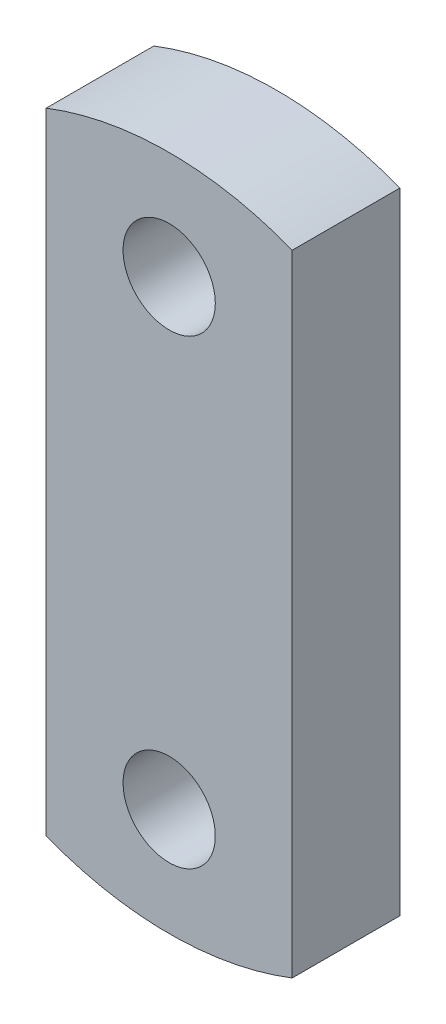
ISO-10303-21;
HEADER;
FILE_DESCRIPTION(('STEP AP214'),'2;1');
FILE_NAME('part.step','',(''),(''),'','','');
FILE_SCHEMA(('AUTOMOTIVE_DESIGN { 1 0 10303 214 1 1 1 1 }'));
ENDSEC;
DATA;
#1=APPLICATION_CONTEXT('core data for automotive mechanical design processes');
#2=APPLICATION_PROTOCOL_DEFINITION('international standard','automotive_design',2000,#1);
#3=PRODUCT_CONTEXT('',#1,'mechanical');
#4=PRODUCT('Part','Part','',(#3));
#5=PRODUCT_RELATED_PRODUCT_CATEGORY('part','',(#4));
#6=PRODUCT_DEFINITION_FORMATION('','',#4);
#7=PRODUCT_DEFINITION_CONTEXT('part definition',#1,'design');
#8=PRODUCT_DEFINITION('design','',#6,#7);
#9=PRODUCT_DEFINITION_SHAPE('','',#8);
#10=(LENGTH_UNIT() NAMED_UNIT(*) SI_UNIT(.MILLI.,.METRE.));
#11=(NAMED_UNIT(*) PLANE_ANGLE_UNIT() SI_UNIT($,.RADIAN.));
#12=(NAMED_UNIT(*) SI_UNIT($,.STERADIAN.) SOLID_ANGLE_UNIT());
#13=UNCERTAINTY_MEASURE_WITH_UNIT(LENGTH_MEASURE(1.E-05),#10,'distance_accuracy_value','');
#14=(GEOMETRIC_REPRESENTATION_CONTEXT(3) GLOBAL_UNCERTAINTY_ASSIGNED_CONTEXT((#13)) GLOBAL_UNIT_ASSIGNED_CONTEXT((#10,
#11,#12)) REPRESENTATION_CONTEXT('',''));
#15=CARTESIAN_POINT('',(0.,0.,0.));
#16=DIRECTION('',(0.,0.,1.));
#17=DIRECTION('',(1.,0.,0.));
#18=AXIS2_PLACEMENT_3D('',#15,#16,#17);
#19=CARTESIAN_POINT('',(0.,0.,35.));
#20=DIRECTION('',(0.,0.,1.));
#21=DIRECTION('',(1.,0.,0.));
#22=AXIS2_PLACEMENT_3D('',#19,#20,#21);
#23=PLANE('',#22);
#24=CARTESIAN_POINT('',(0.,75.,35.));
#25=DIRECTION('',(0.,0.,1.));
#26=DIRECTION('',(1.,0.,0.));
#27=AXIS2_PLACEMENT_3D('',#24,#25,#26);
#28=CIRCLE('',#27,15.);
#29=CARTESIAN_POINT('',(15.,75.,35.));
#30=VERTEX_POINT('',#29);
#31=EDGE_CURVE('E111',#30,#30,#28,.T.);
#32=ORIENTED_EDGE('',*,*,#31,.F.);
#33=EDGE_LOOP('',(#32));
#34=FACE_BOUND('',#33,.T.);
#35=CARTESIAN_POINT('',(0.,0.,35.));
#36=DIRECTION('',(0.,0.,1.));
#37=DIRECTION('',(1.,0.,0.));
#38=AXIS2_PLACEMENT_3D('',#35,#36,#37);
#39=CIRCLE('',#38,110.);
#40=CARTESIAN_POINT('',(-40.,-102.469507659596,35.));
#41=VERTEX_POINT('',#40);
#42=CARTESIAN_POINT('',(40.,-102.469507659596,35.));
#43=VERTEX_POINT('',#42);
#44=EDGE_CURVE('E86',#41,#43,#39,.T.);
#45=ORIENTED_EDGE('',*,*,#44,.T.);
#46=DIRECTION('',(0.,1.,0.));
#47=VECTOR('',#46,1.);
#48=CARTESIAN_POINT('',(40.,102.469507659596,35.));
#49=LINE('',#48,#47);
#50=CARTESIAN_POINT('',(40.,102.469507659596,35.));
#51=VERTEX_POINT('',#50);
#52=EDGE_CURVE('E89',#43,#51,#49,.T.);
#53=ORIENTED_EDGE('',*,*,#52,.T.);
#54=CARTESIAN_POINT('',(0.,0.,35.));
#55=DIRECTION('',(0.,0.,1.));
#56=DIRECTION('',(1.,0.,0.));
#57=AXIS2_PLACEMENT_3D('',#54,#55,#56);
#58=CIRCLE('',#57,110.);
#59=CARTESIAN_POINT('',(-40.,102.469507659596,35.));
#60=VERTEX_POINT('',#59);
#61=EDGE_CURVE('E93',#51,#60,#58,.T.);
#62=ORIENTED_EDGE('',*,*,#61,.T.);
#63=DIRECTION('',(0.,-1.,0.));
#64=VECTOR('',#63,1.);
#65=CARTESIAN_POINT('',(-40.,102.469507659596,35.));
#66=LINE('',#65,#64);
#67=EDGE_CURVE('E57',#60,#41,#66,.T.);
#68=ORIENTED_EDGE('',*,*,#67,.T.);
#69=EDGE_LOOP('',(#45,#53,#62,#68));
#70=FACE_BOUND('',#69,.T.);
#71=CARTESIAN_POINT('',(0.,-75.,35.));
#72=DIRECTION('',(0.,0.,1.));
#73=DIRECTION('',(-1.,0.,0.));
#74=AXIS2_PLACEMENT_3D('',#71,#72,#73);
#75=CIRCLE('',#74,15.);
#76=CARTESIAN_POINT('',(-15.,-75.,35.));
#77=VERTEX_POINT('',#76);
#78=EDGE_CURVE('E138',#77,#77,#75,.T.);
#79=ORIENTED_EDGE('',*,*,#78,.F.);
#80=EDGE_LOOP('',(#79));
#81=FACE_BOUND('',#80,.T.);
#82=ADVANCED_FACE('F39',(#34,#70,#81),#23,.T.);
#83=CARTESIAN_POINT('',(0.,0.,0.));
#84=DIRECTION('',(0.,0.,1.));
#85=DIRECTION('',(1.,0.,0.));
#86=AXIS2_PLACEMENT_3D('',#83,#84,#85);
#87=PLANE('',#86);
#88=CARTESIAN_POINT('',(0.,0.,0.));
#89=DIRECTION('',(0.,0.,1.));
#90=DIRECTION('',(1.,0.,0.));
#91=AXIS2_PLACEMENT_3D('',#88,#89,#90);
#92=CIRCLE('',#91,110.);
#93=CARTESIAN_POINT('',(-40.,-102.469507659596,0.));
#94=VERTEX_POINT('',#93);
#95=CARTESIAN_POINT('',(40.,-102.469507659596,0.));
#96=VERTEX_POINT('',#95);
#97=EDGE_CURVE('E81',#94,#96,#92,.T.);
#98=ORIENTED_EDGE('',*,*,#97,.F.);
#99=DIRECTION('',(0.,-1.,0.));
#100=VECTOR('',#99,1.);
#101=CARTESIAN_POINT('',(-40.,102.469507659596,0.));
#102=LINE('',#101,#100);
#103=CARTESIAN_POINT('',(-40.,102.469507659596,0.));
#104=VERTEX_POINT('',#103);
#105=EDGE_CURVE('E116',#104,#94,#102,.T.);
#106=ORIENTED_EDGE('',*,*,#105,.F.);
#107=CARTESIAN_POINT('',(0.,0.,0.));
#108=DIRECTION('',(0.,0.,1.));
#109=DIRECTION('',(1.,0.,0.));
#110=AXIS2_PLACEMENT_3D('',#107,#108,#109);
#111=CIRCLE('',#110,110.);
#112=CARTESIAN_POINT('',(40.,102.469507659596,0.));
#113=VERTEX_POINT('',#112);
#114=EDGE_CURVE('E74',#113,#104,#111,.T.);
#115=ORIENTED_EDGE('',*,*,#114,.F.);
#116=DIRECTION('',(0.,1.,0.));
#117=VECTOR('',#116,1.);
#118=CARTESIAN_POINT('',(40.,102.469507659596,0.));
#119=LINE('',#118,#117);
#120=EDGE_CURVE('E98',#96,#113,#119,.T.);
#121=ORIENTED_EDGE('',*,*,#120,.F.);
#122=EDGE_LOOP('',(#98,#106,#115,#121));
#123=FACE_BOUND('',#122,.T.);
#124=CARTESIAN_POINT('',(0.,75.,0.));
#125=DIRECTION('',(0.,0.,1.));
#126=DIRECTION('',(1.,0.,0.));
#127=AXIS2_PLACEMENT_3D('',#124,#125,#126);
#128=CIRCLE('',#127,15.);
#129=CARTESIAN_POINT('',(15.,75.,0.));
#130=VERTEX_POINT('',#129);
#131=EDGE_CURVE('E132',#130,#130,#128,.T.);
#132=ORIENTED_EDGE('',*,*,#131,.T.);
#133=EDGE_LOOP('',(#132));
#134=FACE_BOUND('',#133,.T.);
#135=CARTESIAN_POINT('',(0.,-75.,0.));
#136=DIRECTION('',(0.,0.,1.));
#137=DIRECTION('',(-1.,0.,0.));
#138=AXIS2_PLACEMENT_3D('',#135,#136,#137);
#139=CIRCLE('',#138,15.);
#140=CARTESIAN_POINT('',(-15.,-75.,0.));
#141=VERTEX_POINT('',#140);
#142=EDGE_CURVE('E135',#141,#141,#139,.T.);
#143=ORIENTED_EDGE('',*,*,#142,.T.);
#144=EDGE_LOOP('',(#143));
#145=FACE_BOUND('',#144,.T.);
#146=ADVANCED_FACE('F125',(#123,#134,#145),#87,.F.);
#147=CARTESIAN_POINT('',(0.,0.,35.));
#148=DIRECTION('',(0.,0.,-1.));
#149=DIRECTION('',(-1.,0.,0.));
#150=AXIS2_PLACEMENT_3D('',#147,#148,#149);
#151=CYLINDRICAL_SURFACE('',#150,110.);
#152=ORIENTED_EDGE('',*,*,#97,.T.);
#153=DIRECTION('',(0.,0.,-1.));
#154=VECTOR('',#153,1.);
#155=CARTESIAN_POINT('',(40.,-102.469507659596,35.));
#156=LINE('',#155,#154);
#157=EDGE_CURVE('E11',#43,#96,#156,.T.);
#158=ORIENTED_EDGE('',*,*,#157,.F.);
#159=ORIENTED_EDGE('',*,*,#44,.F.);
#160=DIRECTION('',(0.,0.,-1.));
#161=VECTOR('',#160,1.);
#162=CARTESIAN_POINT('',(-40.,-102.469507659596,35.));
#163=LINE('',#162,#161);
#164=EDGE_CURVE('E105',#41,#94,#163,.T.);
#165=ORIENTED_EDGE('',*,*,#164,.T.);
#166=EDGE_LOOP('',(#152,#158,#159,#165));
#167=FACE_BOUND('',#166,.T.);
#168=ADVANCED_FACE('F41',(#167),#151,.T.);
#169=CARTESIAN_POINT('',(40.,102.469507659596,35.));
#170=DIRECTION('',(-1.,0.,0.));
#171=DIRECTION('',(0.,0.,1.));
#172=AXIS2_PLACEMENT_3D('',#169,#170,#171);
#173=PLANE('',#172);
#174=ORIENTED_EDGE('',*,*,#120,.T.);
#175=DIRECTION('',(0.,0.,-1.));
#176=VECTOR('',#175,1.);
#177=CARTESIAN_POINT('',(40.,102.469507659596,35.));
#178=LINE('',#177,#176);
#179=EDGE_CURVE('E49',#51,#113,#178,.T.);
#180=ORIENTED_EDGE('',*,*,#179,.F.);
#181=ORIENTED_EDGE('',*,*,#52,.F.);
#182=ORIENTED_EDGE('',*,*,#157,.T.);
#183=EDGE_LOOP('',(#174,#180,#181,#182));
#184=FACE_BOUND('',#183,.T.);
#185=ADVANCED_FACE('F97',(#184),#173,.F.);
#186=CARTESIAN_POINT('',(0.,0.,35.));
#187=DIRECTION('',(0.,0.,-1.));
#188=DIRECTION('',(-1.,0.,0.));
#189=AXIS2_PLACEMENT_3D('',#186,#187,#188);
#190=CYLINDRICAL_SURFACE('',#189,110.);
#191=ORIENTED_EDGE('',*,*,#114,.T.);
#192=DIRECTION('',(0.,0.,-1.));
#193=VECTOR('',#192,1.);
#194=CARTESIAN_POINT('',(-40.,102.469507659596,35.));
#195=LINE('',#194,#193);
#196=EDGE_CURVE('E100',#60,#104,#195,.T.);
#197=ORIENTED_EDGE('',*,*,#196,.F.);
#198=ORIENTED_EDGE('',*,*,#61,.F.);
#199=ORIENTED_EDGE('',*,*,#179,.T.);
#200=EDGE_LOOP('',(#191,#197,#198,#199));
#201=FACE_BOUND('',#200,.T.);
#202=ADVANCED_FACE('F101',(#201),#190,.T.);
#203=CARTESIAN_POINT('',(-40.,102.469507659596,35.));
#204=DIRECTION('',(1.,0.,0.));
#205=DIRECTION('',(0.,0.,-1.));
#206=AXIS2_PLACEMENT_3D('',#203,#204,#205);
#207=PLANE('',#206);
#208=ORIENTED_EDGE('',*,*,#105,.T.);
#209=ORIENTED_EDGE('',*,*,#164,.F.);
#210=ORIENTED_EDGE('',*,*,#67,.F.);
#211=ORIENTED_EDGE('',*,*,#196,.T.);
#212=EDGE_LOOP('',(#208,#209,#210,#211));
#213=FACE_BOUND('',#212,.T.);
#214=ADVANCED_FACE('F124',(#213),#207,.F.);
#215=CARTESIAN_POINT('',(0.,75.,35.));
#216=DIRECTION('',(0.,0.,-1.));
#217=DIRECTION('',(-1.,0.,0.));
#218=AXIS2_PLACEMENT_3D('',#215,#216,#217);
#219=CYLINDRICAL_SURFACE('',#218,15.);
#220=ORIENTED_EDGE('',*,*,#31,.T.);
#221=EDGE_LOOP('',(#220));
#222=FACE_BOUND('',#221,.T.);
#223=ORIENTED_EDGE('',*,*,#131,.F.);
#224=EDGE_LOOP('',(#223));
#225=FACE_BOUND('',#224,.T.);
#226=ADVANCED_FACE('F151',(#222,#225),#219,.F.);
#227=CARTESIAN_POINT('',(0.,-75.,35.));
#228=DIRECTION('',(0.,0.,-1.));
#229=DIRECTION('',(-1.,0.,0.));
#230=AXIS2_PLACEMENT_3D('',#227,#228,#229);
#231=CYLINDRICAL_SURFACE('',#230,15.);
#232=ORIENTED_EDGE('',*,*,#78,.T.);
#233=EDGE_LOOP('',(#232));
#234=FACE_BOUND('',#233,.T.);
#235=ORIENTED_EDGE('',*,*,#142,.F.);
#236=EDGE_LOOP('',(#235));
#237=FACE_BOUND('',#236,.T.);
#238=ADVANCED_FACE('F208',(#234,#237),#231,.F.);
#239=CLOSED_SHELL('',(#82,#146,#168,#185,#202,#214,#226,#238));
#240=MANIFOLD_SOLID_BREP('B2',#239);
#241=ADVANCED_BREP_SHAPE_REPRESENTATION('',(#18,#240),#14);
#242=SHAPE_DEFINITION_REPRESENTATION(#9,#241);
ENDSEC;
END-ISO-10303-21;
